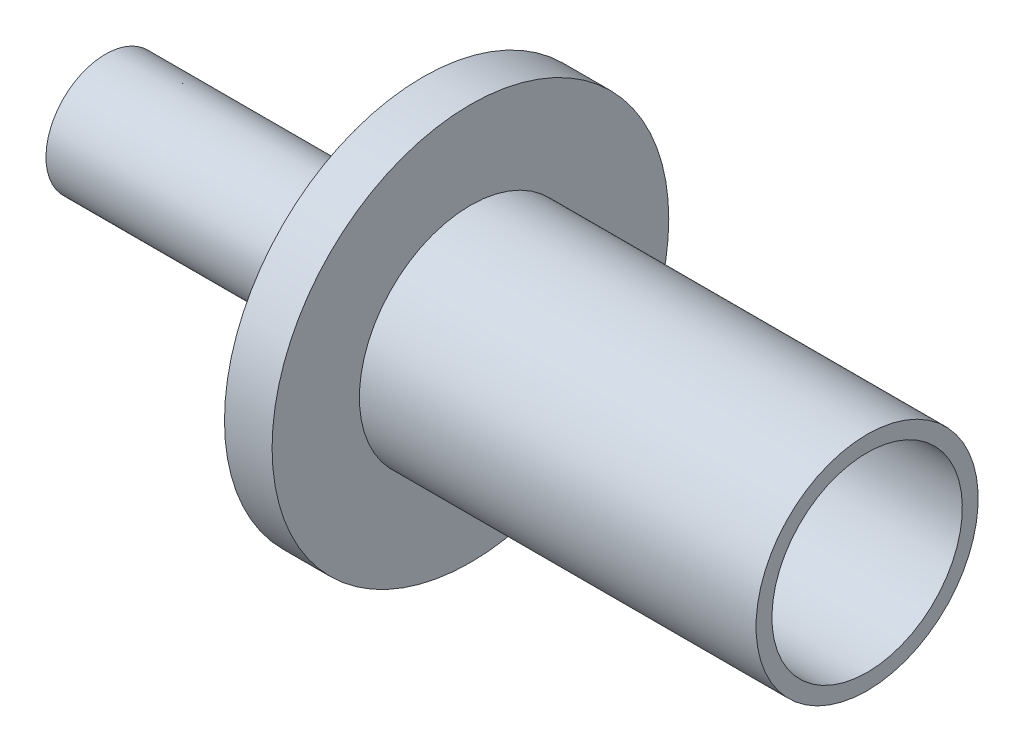
ISO-10303-21;
HEADER;
FILE_DESCRIPTION(('STEP AP214'),'2;1');
FILE_NAME('part.step','',(''),(''),'','','');
FILE_SCHEMA(('AUTOMOTIVE_DESIGN { 1 0 10303 214 1 1 1 1 }'));
ENDSEC;
DATA;
#1=APPLICATION_CONTEXT('core data for automotive mechanical design processes');
#2=APPLICATION_PROTOCOL_DEFINITION('international standard','automotive_design',2000,#1);
#3=PRODUCT_CONTEXT('',#1,'mechanical');
#4=PRODUCT('Part','Part','',(#3));
#5=PRODUCT_RELATED_PRODUCT_CATEGORY('part','',(#4));
#6=PRODUCT_DEFINITION_FORMATION('','',#4);
#7=PRODUCT_DEFINITION_CONTEXT('part definition',#1,'design');
#8=PRODUCT_DEFINITION('design','',#6,#7);
#9=PRODUCT_DEFINITION_SHAPE('','',#8);
#10=(LENGTH_UNIT() NAMED_UNIT(*) SI_UNIT(.MILLI.,.METRE.));
#11=(NAMED_UNIT(*) PLANE_ANGLE_UNIT() SI_UNIT($,.RADIAN.));
#12=(NAMED_UNIT(*) SI_UNIT($,.STERADIAN.) SOLID_ANGLE_UNIT());
#13=UNCERTAINTY_MEASURE_WITH_UNIT(LENGTH_MEASURE(1.E-05),#10,'distance_accuracy_value','');
#14=(GEOMETRIC_REPRESENTATION_CONTEXT(3) GLOBAL_UNCERTAINTY_ASSIGNED_CONTEXT((#13)) GLOBAL_UNIT_ASSIGNED_CONTEXT((#10,
#11,#12)) REPRESENTATION_CONTEXT('',''));
#15=CARTESIAN_POINT('',(0.,0.,0.));
#16=DIRECTION('',(0.,0.,1.));
#17=DIRECTION('',(1.,0.,0.));
#18=AXIS2_PLACEMENT_3D('',#15,#16,#17);
#19=CARTESIAN_POINT('',(-64.9001174574378,0.,0.));
#20=DIRECTION('',(-1.,0.,0.));
#21=DIRECTION('',(0.,-1.,0.));
#22=AXIS2_PLACEMENT_3D('',#19,#20,#21);
#23=CYLINDRICAL_SURFACE('',#22,6.50000000000001);
#24=CARTESIAN_POINT('',(-40.,0.,0.));
#25=DIRECTION('',(-1.,0.,0.));
#26=DIRECTION('',(0.,-1.,0.));
#27=AXIS2_PLACEMENT_3D('',#24,#25,#26);
#28=CIRCLE('',#27,6.50000000000001);
#29=CARTESIAN_POINT('',(-40.,-6.50000000000003,0.));
#30=VERTEX_POINT('',#29);
#31=EDGE_CURVE('E116',#30,#30,#28,.T.);
#32=ORIENTED_EDGE('',*,*,#31,.T.);
#33=EDGE_LOOP('',(#32));
#34=FACE_BOUND('',#33,.T.);
#35=DIRECTION('',(1.,0.,0.));
#36=VECTOR('',#35,1.);
#37=CARTESIAN_POINT('',(19.,0.,6.5));
#38=LINE('',#37,#36);
#39=CARTESIAN_POINT('',(11.,0.,6.5));
#40=VERTEX_POINT('',#39);
#41=CARTESIAN_POINT('',(19.,0.,6.50000000000001));
#42=VERTEX_POINT('',#41);
#43=EDGE_CURVE('E91',#40,#42,#38,.T.);
#44=ORIENTED_EDGE('',*,*,#43,.F.);
#45=CARTESIAN_POINT('',(11.,0.,0.));
#46=DIRECTION('',(-1.,0.,0.));
#47=DIRECTION('',(0.,0.,1.));
#48=AXIS2_PLACEMENT_3D('',#45,#46,#47);
#49=CIRCLE('',#48,6.50000000000001);
#50=CARTESIAN_POINT('',(11.,0.,-6.5));
#51=VERTEX_POINT('',#50);
#52=EDGE_CURVE('E176',#51,#40,#49,.T.);
#53=ORIENTED_EDGE('',*,*,#52,.F.);
#54=DIRECTION('',(-1.,0.,0.));
#55=VECTOR('',#54,1.);
#56=CARTESIAN_POINT('',(19.,0.,-6.5));
#57=LINE('',#56,#55);
#58=CARTESIAN_POINT('',(19.,0.,-6.5));
#59=VERTEX_POINT('',#58);
#60=EDGE_CURVE('E103',#59,#51,#57,.T.);
#61=ORIENTED_EDGE('',*,*,#60,.F.);
#62=CARTESIAN_POINT('',(19.,0.,0.));
#63=DIRECTION('',(-1.,0.,0.));
#64=DIRECTION('',(0.,-1.,0.));
#65=AXIS2_PLACEMENT_3D('',#62,#63,#64);
#66=CIRCLE('',#65,6.50000000000001);
#67=EDGE_CURVE('E110',#42,#59,#66,.T.);
#68=ORIENTED_EDGE('',*,*,#67,.F.);
#69=EDGE_LOOP('',(#44,#53,#61,#68));
#70=FACE_BOUND('',#69,.T.);
#71=ADVANCED_FACE('F45',(#34,#70),#23,.F.);
#72=CARTESIAN_POINT('',(-64.9001174574378,0.,0.));
#73=DIRECTION('',(-1.,0.,0.));
#74=DIRECTION('',(0.,-1.,0.));
#75=AXIS2_PLACEMENT_3D('',#72,#73,#74);
#76=CYLINDRICAL_SURFACE('',#75,25.);
#77=CARTESIAN_POINT('',(0.,0.,0.));
#78=DIRECTION('',(-1.,0.,0.));
#79=DIRECTION('',(0.,-1.,0.));
#80=AXIS2_PLACEMENT_3D('',#77,#78,#79);
#81=CIRCLE('',#80,25.);
#82=CARTESIAN_POINT('',(0.,-25.,0.));
#83=VERTEX_POINT('',#82);
#84=EDGE_CURVE('E13',#83,#83,#81,.T.);
#85=ORIENTED_EDGE('',*,*,#84,.F.);
#86=EDGE_LOOP('',(#85));
#87=FACE_BOUND('',#86,.T.);
#88=CARTESIAN_POINT('',(6.00000000000001,0.,0.));
#89=DIRECTION('',(-1.,0.,0.));
#90=DIRECTION('',(0.,-1.,0.));
#91=AXIS2_PLACEMENT_3D('',#88,#89,#90);
#92=CIRCLE('',#91,25.);
#93=CARTESIAN_POINT('',(6.00000000000001,-25.,0.));
#94=VERTEX_POINT('',#93);
#95=EDGE_CURVE('E140',#94,#94,#92,.T.);
#96=ORIENTED_EDGE('',*,*,#95,.T.);
#97=EDGE_LOOP('',(#96));
#98=FACE_BOUND('',#97,.T.);
#99=ADVANCED_FACE('F47',(#87,#98),#76,.T.);
#100=CARTESIAN_POINT('',(0.,25.,0.));
#101=DIRECTION('',(1.,0.,0.));
#102=DIRECTION('',(0.,1.,0.));
#103=AXIS2_PLACEMENT_3D('',#100,#101,#102);
#104=PLANE('',#103);
#105=CARTESIAN_POINT('',(0.,0.,0.));
#106=DIRECTION('',(-1.,0.,0.));
#107=DIRECTION('',(0.,-1.,0.));
#108=AXIS2_PLACEMENT_3D('',#105,#106,#107);
#109=CIRCLE('',#108,7.50000000000001);
#110=CARTESIAN_POINT('',(0.,-7.50000000000002,0.));
#111=VERTEX_POINT('',#110);
#112=EDGE_CURVE('E53',#111,#111,#109,.T.);
#113=ORIENTED_EDGE('',*,*,#112,.F.);
#114=EDGE_LOOP('',(#113));
#115=FACE_BOUND('',#114,.T.);
#116=ORIENTED_EDGE('',*,*,#84,.T.);
#117=EDGE_LOOP('',(#116));
#118=FACE_BOUND('',#117,.T.);
#119=ADVANCED_FACE('F131',(#115,#118),#104,.F.);
#120=CARTESIAN_POINT('',(-64.9001174574378,0.,0.));
#121=DIRECTION('',(-1.,0.,0.));
#122=DIRECTION('',(0.,-1.,0.));
#123=AXIS2_PLACEMENT_3D('',#120,#121,#122);
#124=CYLINDRICAL_SURFACE('',#123,7.50000000000002);
#125=CARTESIAN_POINT('',(-40.,0.,0.));
#126=DIRECTION('',(-1.,0.,0.));
#127=DIRECTION('',(0.,-1.,0.));
#128=AXIS2_PLACEMENT_3D('',#125,#126,#127);
#129=CIRCLE('',#128,7.50000000000002);
#130=CARTESIAN_POINT('',(-40.,-7.50000000000004,0.));
#131=VERTEX_POINT('',#130);
#132=EDGE_CURVE('E119',#131,#131,#129,.T.);
#133=ORIENTED_EDGE('',*,*,#132,.F.);
#134=EDGE_LOOP('',(#133));
#135=FACE_BOUND('',#134,.T.);
#136=ORIENTED_EDGE('',*,*,#112,.T.);
#137=EDGE_LOOP('',(#136));
#138=FACE_BOUND('',#137,.T.);
#139=ADVANCED_FACE('F129',(#135,#138),#124,.T.);
#140=CARTESIAN_POINT('',(-40.,6.49999999999999,0.));
#141=DIRECTION('',(1.,0.,0.));
#142=DIRECTION('',(0.,1.,0.));
#143=AXIS2_PLACEMENT_3D('',#140,#141,#142);
#144=PLANE('',#143);
#145=ORIENTED_EDGE('',*,*,#31,.F.);
#146=EDGE_LOOP('',(#145));
#147=FACE_BOUND('',#146,.T.);
#148=ORIENTED_EDGE('',*,*,#132,.T.);
#149=EDGE_LOOP('',(#148));
#150=FACE_BOUND('',#149,.T.);
#151=ADVANCED_FACE('F205',(#147,#150),#144,.F.);
#152=CARTESIAN_POINT('',(19.,12.,0.));
#153=DIRECTION('',(-1.,0.,0.));
#154=DIRECTION('',(0.,-1.,0.));
#155=AXIS2_PLACEMENT_3D('',#152,#153,#154);
#156=PLANE('',#155);
#157=CARTESIAN_POINT('',(19.,0.,0.));
#158=DIRECTION('',(-1.,0.,0.));
#159=DIRECTION('',(0.,-1.,0.));
#160=AXIS2_PLACEMENT_3D('',#157,#158,#159);
#161=CIRCLE('',#160,12.);
#162=CARTESIAN_POINT('',(19.,-10.087120500916,6.5));
#163=VERTEX_POINT('',#162);
#164=CARTESIAN_POINT('',(19.,-10.087120500916,-6.49999999999999));
#165=VERTEX_POINT('',#164);
#166=EDGE_CURVE('E112',#163,#165,#161,.T.);
#167=ORIENTED_EDGE('',*,*,#166,.F.);
#168=DIRECTION('',(0.,1.,0.));
#169=VECTOR('',#168,1.);
#170=CARTESIAN_POINT('',(19.,-25.001,6.5));
#171=LINE('',#170,#169);
#172=EDGE_CURVE('E95',#163,#42,#171,.T.);
#173=ORIENTED_EDGE('',*,*,#172,.T.);
#174=ORIENTED_EDGE('',*,*,#67,.T.);
#175=DIRECTION('',(0.,1.,0.));
#176=VECTOR('',#175,1.);
#177=CARTESIAN_POINT('',(19.,-25.001,-6.5));
#178=LINE('',#177,#176);
#179=EDGE_CURVE('E102',#165,#59,#178,.T.);
#180=ORIENTED_EDGE('',*,*,#179,.F.);
#181=EDGE_LOOP('',(#167,#173,#174,#180));
#182=FACE_BOUND('',#181,.T.);
#183=ADVANCED_FACE('F108',(#182),#156,.F.);
#184=CARTESIAN_POINT('',(-64.9001174574378,0.,0.));
#185=DIRECTION('',(-1.,0.,0.));
#186=DIRECTION('',(0.,-1.,0.));
#187=AXIS2_PLACEMENT_3D('',#184,#185,#186);
#188=CYLINDRICAL_SURFACE('',#187,12.);
#189=CARTESIAN_POINT('',(56.,0.,0.));
#190=DIRECTION('',(-1.,0.,0.));
#191=DIRECTION('',(0.,-1.,0.));
#192=AXIS2_PLACEMENT_3D('',#189,#190,#191);
#193=CIRCLE('',#192,12.);
#194=CARTESIAN_POINT('',(56.,-12.,0.));
#195=VERTEX_POINT('',#194);
#196=EDGE_CURVE('E121',#195,#195,#193,.T.);
#197=ORIENTED_EDGE('',*,*,#196,.F.);
#198=EDGE_LOOP('',(#197));
#199=FACE_BOUND('',#198,.T.);
#200=ORIENTED_EDGE('',*,*,#166,.T.);
#201=CARTESIAN_POINT('',(19.,0.,0.));
#202=DIRECTION('',(1.,0.,0.));
#203=DIRECTION('',(0.,0.,-1.));
#204=AXIS2_PLACEMENT_3D('',#201,#202,#203);
#205=CIRCLE('',#204,12.);
#206=EDGE_CURVE('E143',#165,#163,#205,.F.);
#207=ORIENTED_EDGE('',*,*,#206,.T.);
#208=EDGE_LOOP('',(#200,#207));
#209=FACE_BOUND('',#208,.T.);
#210=ADVANCED_FACE('F158',(#199,#209),#188,.F.);
#211=CARTESIAN_POINT('',(56.,12.,0.));
#212=DIRECTION('',(-1.,0.,0.));
#213=DIRECTION('',(0.,-1.,0.));
#214=AXIS2_PLACEMENT_3D('',#211,#212,#213);
#215=PLANE('',#214);
#216=CARTESIAN_POINT('',(56.,0.,0.));
#217=DIRECTION('',(-1.,0.,0.));
#218=DIRECTION('',(0.,-1.,0.));
#219=AXIS2_PLACEMENT_3D('',#216,#217,#218);
#220=CIRCLE('',#219,14.);
#221=CARTESIAN_POINT('',(56.,-14.,0.));
#222=VERTEX_POINT('',#221);
#223=EDGE_CURVE('E146',#222,#222,#220,.T.);
#224=ORIENTED_EDGE('',*,*,#223,.F.);
#225=EDGE_LOOP('',(#224));
#226=FACE_BOUND('',#225,.T.);
#227=ORIENTED_EDGE('',*,*,#196,.T.);
#228=EDGE_LOOP('',(#227));
#229=FACE_BOUND('',#228,.T.);
#230=ADVANCED_FACE('F156',(#226,#229),#215,.F.);
#231=CARTESIAN_POINT('',(-64.9001174574378,0.,0.));
#232=DIRECTION('',(-1.,0.,0.));
#233=DIRECTION('',(0.,-1.,0.));
#234=AXIS2_PLACEMENT_3D('',#231,#232,#233);
#235=CYLINDRICAL_SURFACE('',#234,14.);
#236=DIRECTION('',(-1.,0.,0.));
#237=VECTOR('',#236,1.);
#238=CARTESIAN_POINT('',(-64.9001174574378,-12.3995967676373,6.50000000000001));
#239=LINE('',#238,#237);
#240=CARTESIAN_POINT('',(19.,-12.3995967676373,6.5));
#241=VERTEX_POINT('',#240);
#242=CARTESIAN_POINT('',(11.,-12.3995967676373,6.5));
#243=VERTEX_POINT('',#242);
#244=EDGE_CURVE('E179',#241,#243,#239,.T.);
#245=ORIENTED_EDGE('',*,*,#244,.F.);
#246=CARTESIAN_POINT('',(19.,0.,0.));
#247=DIRECTION('',(1.,0.,0.));
#248=DIRECTION('',(0.,0.,-1.));
#249=AXIS2_PLACEMENT_3D('',#246,#247,#248);
#250=CIRCLE('',#249,14.);
#251=CARTESIAN_POINT('',(19.,-12.3995967676372,-6.50000000000001));
#252=VERTEX_POINT('',#251);
#253=EDGE_CURVE('E177',#252,#241,#250,.F.);
#254=ORIENTED_EDGE('',*,*,#253,.F.);
#255=DIRECTION('',(-1.,0.,0.));
#256=VECTOR('',#255,1.);
#257=CARTESIAN_POINT('',(-64.9001174574378,-12.3995967676373,-6.50000000000001));
#258=LINE('',#257,#256);
#259=CARTESIAN_POINT('',(11.,-12.3995967676372,-6.50000000000001));
#260=VERTEX_POINT('',#259);
#261=EDGE_CURVE('E148',#260,#252,#258,.F.);
#262=ORIENTED_EDGE('',*,*,#261,.F.);
#263=CARTESIAN_POINT('',(11.,0.,0.));
#264=DIRECTION('',(-1.,0.,0.));
#265=DIRECTION('',(0.,0.,1.));
#266=AXIS2_PLACEMENT_3D('',#263,#264,#265);
#267=CIRCLE('',#266,14.);
#268=EDGE_CURVE('E68',#243,#260,#267,.F.);
#269=ORIENTED_EDGE('',*,*,#268,.F.);
#270=EDGE_LOOP('',(#245,#254,#262,#269));
#271=FACE_BOUND('',#270,.T.);
#272=CARTESIAN_POINT('',(6.00000000000002,0.,0.));
#273=DIRECTION('',(-1.,0.,0.));
#274=DIRECTION('',(0.,-1.,0.));
#275=AXIS2_PLACEMENT_3D('',#272,#273,#274);
#276=CIRCLE('',#275,14.);
#277=CARTESIAN_POINT('',(6.00000000000002,-14.,0.));
#278=VERTEX_POINT('',#277);
#279=EDGE_CURVE('E142',#278,#278,#276,.T.);
#280=ORIENTED_EDGE('',*,*,#279,.F.);
#281=EDGE_LOOP('',(#280));
#282=FACE_BOUND('',#281,.T.);
#283=ORIENTED_EDGE('',*,*,#223,.T.);
#284=EDGE_LOOP('',(#283));
#285=FACE_BOUND('',#284,.T.);
#286=ADVANCED_FACE('F185',(#271,#282,#285),#235,.T.);
#287=CARTESIAN_POINT('',(6.00000000000001,14.,0.));
#288=DIRECTION('',(-1.,0.,0.));
#289=DIRECTION('',(0.,-1.,0.));
#290=AXIS2_PLACEMENT_3D('',#287,#288,#289);
#291=PLANE('',#290);
#292=ORIENTED_EDGE('',*,*,#95,.F.);
#293=EDGE_LOOP('',(#292));
#294=FACE_BOUND('',#293,.T.);
#295=ORIENTED_EDGE('',*,*,#279,.T.);
#296=EDGE_LOOP('',(#295));
#297=FACE_BOUND('',#296,.T.);
#298=ADVANCED_FACE('F188',(#294,#297),#291,.F.);
#299=CARTESIAN_POINT('',(19.,-25.001,6.5));
#300=DIRECTION('',(1.,0.,0.));
#301=DIRECTION('',(0.,0.,-1.));
#302=AXIS2_PLACEMENT_3D('',#299,#300,#301);
#303=PLANE('',#302);
#304=EDGE_CURVE('E164',#252,#165,#178,.T.);
#305=ORIENTED_EDGE('',*,*,#304,.F.);
#306=ORIENTED_EDGE('',*,*,#253,.T.);
#307=EDGE_CURVE('E60',#241,#163,#171,.T.);
#308=ORIENTED_EDGE('',*,*,#307,.T.);
#309=ORIENTED_EDGE('',*,*,#206,.F.);
#310=EDGE_LOOP('',(#305,#306,#308,#309));
#311=FACE_BOUND('',#310,.T.);
#312=ADVANCED_FACE('F163',(#311),#303,.F.);
#313=CARTESIAN_POINT('',(19.,-25.001,6.5));
#314=DIRECTION('',(0.,0.,1.));
#315=DIRECTION('',(1.,0.,0.));
#316=AXIS2_PLACEMENT_3D('',#313,#314,#315);
#317=PLANE('',#316);
#318=ORIENTED_EDGE('',*,*,#244,.T.);
#319=DIRECTION('',(0.,1.,0.));
#320=VECTOR('',#319,1.);
#321=CARTESIAN_POINT('',(11.,-25.001,6.5));
#322=LINE('',#321,#320);
#323=EDGE_CURVE('E97',#243,#40,#322,.T.);
#324=ORIENTED_EDGE('',*,*,#323,.T.);
#325=ORIENTED_EDGE('',*,*,#43,.T.);
#326=ORIENTED_EDGE('',*,*,#172,.F.);
#327=ORIENTED_EDGE('',*,*,#307,.F.);
#328=EDGE_LOOP('',(#318,#324,#325,#326,#327));
#329=FACE_BOUND('',#328,.T.);
#330=ADVANCED_FACE('F94',(#329),#317,.F.);
#331=CARTESIAN_POINT('',(11.,-25.001,6.5));
#332=DIRECTION('',(-1.,0.,0.));
#333=DIRECTION('',(0.,0.,1.));
#334=AXIS2_PLACEMENT_3D('',#331,#332,#333);
#335=PLANE('',#334);
#336=ORIENTED_EDGE('',*,*,#52,.T.);
#337=ORIENTED_EDGE('',*,*,#323,.F.);
#338=ORIENTED_EDGE('',*,*,#268,.T.);
#339=DIRECTION('',(0.,1.,0.));
#340=VECTOR('',#339,1.);
#341=CARTESIAN_POINT('',(11.,-25.001,-6.5));
#342=LINE('',#341,#340);
#343=EDGE_CURVE('E170',#260,#51,#342,.T.);
#344=ORIENTED_EDGE('',*,*,#343,.T.);
#345=EDGE_LOOP('',(#336,#337,#338,#344));
#346=FACE_BOUND('',#345,.T.);
#347=ADVANCED_FACE('F175',(#346),#335,.F.);
#348=CARTESIAN_POINT('',(19.,-25.001,-6.5));
#349=DIRECTION('',(0.,0.,-1.));
#350=DIRECTION('',(-1.,0.,0.));
#351=AXIS2_PLACEMENT_3D('',#348,#349,#350);
#352=PLANE('',#351);
#353=ORIENTED_EDGE('',*,*,#261,.T.);
#354=ORIENTED_EDGE('',*,*,#304,.T.);
#355=ORIENTED_EDGE('',*,*,#179,.T.);
#356=ORIENTED_EDGE('',*,*,#60,.T.);
#357=ORIENTED_EDGE('',*,*,#343,.F.);
#358=EDGE_LOOP('',(#353,#354,#355,#356,#357));
#359=FACE_BOUND('',#358,.T.);
#360=ADVANCED_FACE('F167',(#359),#352,.F.);
#361=CLOSED_SHELL('',(#71,#99,#119,#139,#151,#183,#210,#230,#286,#298,#312,#330,#347,#360));
#362=MANIFOLD_SOLID_BREP('B2',#361);
#363=ADVANCED_BREP_SHAPE_REPRESENTATION('',(#18,#362),#14);
#364=SHAPE_DEFINITION_REPRESENTATION(#9,#363);
ENDSEC;
END-ISO-10303-21;
